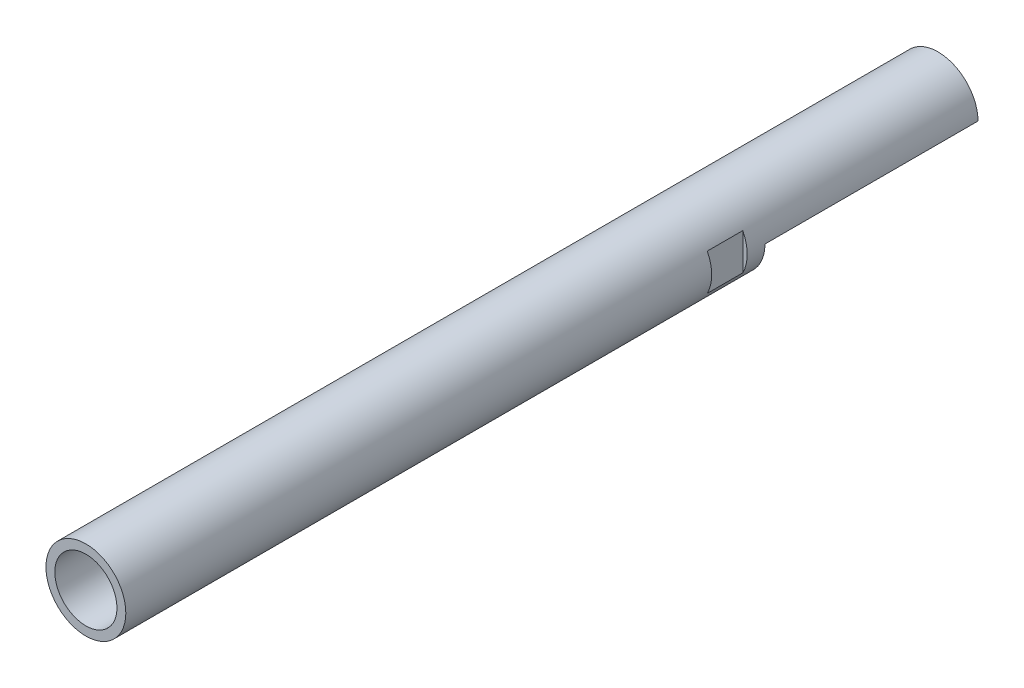
ISO-10303-21;
HEADER;
FILE_DESCRIPTION(('STEP AP214'),'2;1');
FILE_NAME('part.step','',(''),(''),'','','');
FILE_SCHEMA(('AUTOMOTIVE_DESIGN { 1 0 10303 214 1 1 1 1 }'));
ENDSEC;
DATA;
#1=APPLICATION_CONTEXT('core data for automotive mechanical design processes');
#2=APPLICATION_PROTOCOL_DEFINITION('international standard','automotive_design',2000,#1);
#3=PRODUCT_CONTEXT('',#1,'mechanical');
#4=PRODUCT('Part','Part','',(#3));
#5=PRODUCT_RELATED_PRODUCT_CATEGORY('part','',(#4));
#6=PRODUCT_DEFINITION_FORMATION('','',#4);
#7=PRODUCT_DEFINITION_CONTEXT('part definition',#1,'design');
#8=PRODUCT_DEFINITION('design','',#6,#7);
#9=PRODUCT_DEFINITION_SHAPE('','',#8);
#10=(LENGTH_UNIT() NAMED_UNIT(*) SI_UNIT(.MILLI.,.METRE.));
#11=(NAMED_UNIT(*) PLANE_ANGLE_UNIT() SI_UNIT($,.RADIAN.));
#12=(NAMED_UNIT(*) SI_UNIT($,.STERADIAN.) SOLID_ANGLE_UNIT());
#13=UNCERTAINTY_MEASURE_WITH_UNIT(LENGTH_MEASURE(1.E-05),#10,'distance_accuracy_value','');
#14=(GEOMETRIC_REPRESENTATION_CONTEXT(3) GLOBAL_UNCERTAINTY_ASSIGNED_CONTEXT((#13)) GLOBAL_UNIT_ASSIGNED_CONTEXT((#10,
#11,#12)) REPRESENTATION_CONTEXT('',''));
#15=CARTESIAN_POINT('',(0.,0.,0.));
#16=DIRECTION('',(0.,0.,1.));
#17=DIRECTION('',(1.,0.,0.));
#18=AXIS2_PLACEMENT_3D('',#15,#16,#17);
#19=CARTESIAN_POINT('',(0.,0.,304.8));
#20=DIRECTION('',(0.,0.,-1.));
#21=DIRECTION('',(-1.,0.,0.));
#22=AXIS2_PLACEMENT_3D('',#19,#20,#21);
#23=CYLINDRICAL_SURFACE('',#22,14.2875);
#24=CARTESIAN_POINT('',(0.,0.,95.25));
#25=DIRECTION('',(0.,0.,-1.));
#26=DIRECTION('',(-1.,0.,0.));
#27=AXIS2_PLACEMENT_3D('',#24,#25,#26);
#28=CIRCLE('',#27,14.2875);
#29=CARTESIAN_POINT('',(12.7,6.54543018066803,95.25));
#30=VERTEX_POINT('',#29);
#31=CARTESIAN_POINT('',(12.7,-6.54543018066804,95.25));
#32=VERTEX_POINT('',#31);
#33=EDGE_CURVE('E125',#30,#32,#28,.T.);
#34=ORIENTED_EDGE('',*,*,#33,.F.);
#35=DIRECTION('',(0.,0.,-1.));
#36=VECTOR('',#35,1.);
#37=CARTESIAN_POINT('',(12.7,6.54543018066803,95.25));
#38=LINE('',#37,#36);
#39=CARTESIAN_POINT('',(12.7,6.54543018066803,82.55));
#40=VERTEX_POINT('',#39);
#41=EDGE_CURVE('E129',#30,#40,#38,.T.);
#42=ORIENTED_EDGE('',*,*,#41,.T.);
#43=CARTESIAN_POINT('',(0.,0.,82.55));
#44=DIRECTION('',(0.,0.,-1.));
#45=DIRECTION('',(-1.,0.,0.));
#46=AXIS2_PLACEMENT_3D('',#43,#44,#45);
#47=CIRCLE('',#46,14.2875);
#48=CARTESIAN_POINT('',(12.7,-6.54543018066803,82.55));
#49=VERTEX_POINT('',#48);
#50=EDGE_CURVE('E126',#40,#49,#47,.T.);
#51=ORIENTED_EDGE('',*,*,#50,.T.);
#52=DIRECTION('',(0.,0.,-1.));
#53=VECTOR('',#52,1.);
#54=CARTESIAN_POINT('',(12.7,-6.54543018066804,95.25));
#55=LINE('',#54,#53);
#56=EDGE_CURVE('E119',#32,#49,#55,.T.);
#57=ORIENTED_EDGE('',*,*,#56,.F.);
#58=EDGE_LOOP('',(#34,#42,#51,#57));
#59=FACE_BOUND('',#58,.T.);
#60=CARTESIAN_POINT('',(0.,0.,304.8));
#61=DIRECTION('',(0.,0.,1.));
#62=DIRECTION('',(1.,0.,0.));
#63=AXIS2_PLACEMENT_3D('',#60,#61,#62);
#64=CIRCLE('',#63,14.2875);
#65=CARTESIAN_POINT('',(14.2875,0.,304.8));
#66=VERTEX_POINT('',#65);
#67=EDGE_CURVE('E11',#66,#66,#64,.T.);
#68=ORIENTED_EDGE('',*,*,#67,.F.);
#69=EDGE_LOOP('',(#68));
#70=FACE_BOUND('',#69,.T.);
#71=CARTESIAN_POINT('',(0.,0.,76.2));
#72=DIRECTION('',(0.,0.,-1.));
#73=DIRECTION('',(-1.,0.,0.));
#74=AXIS2_PLACEMENT_3D('',#71,#72,#73);
#75=CIRCLE('',#74,14.2875);
#76=CARTESIAN_POINT('',(14.2875,0.,76.2));
#77=VERTEX_POINT('',#76);
#78=CARTESIAN_POINT('',(-14.2875,0.,76.2));
#79=VERTEX_POINT('',#78);
#80=EDGE_CURVE('E137',#77,#79,#75,.T.);
#81=ORIENTED_EDGE('',*,*,#80,.F.);
#82=DIRECTION('',(0.,0.,-1.));
#83=VECTOR('',#82,1.);
#84=CARTESIAN_POINT('',(14.2875,0.,76.2));
#85=LINE('',#84,#83);
#86=CARTESIAN_POINT('',(14.2875,0.,0.));
#87=VERTEX_POINT('',#86);
#88=EDGE_CURVE('E146',#77,#87,#85,.T.);
#89=ORIENTED_EDGE('',*,*,#88,.T.);
#90=CARTESIAN_POINT('',(0.,0.,0.));
#91=DIRECTION('',(0.,0.,1.));
#92=DIRECTION('',(1.,0.,0.));
#93=AXIS2_PLACEMENT_3D('',#90,#91,#92);
#94=CIRCLE('',#93,14.2875);
#95=CARTESIAN_POINT('',(-14.2875,0.,0.));
#96=VERTEX_POINT('',#95);
#97=EDGE_CURVE('E41',#87,#96,#94,.T.);
#98=ORIENTED_EDGE('',*,*,#97,.T.);
#99=DIRECTION('',(0.,0.,-1.));
#100=VECTOR('',#99,1.);
#101=CARTESIAN_POINT('',(-14.2875,0.,76.2));
#102=LINE('',#101,#100);
#103=EDGE_CURVE('E144',#79,#96,#102,.T.);
#104=ORIENTED_EDGE('',*,*,#103,.F.);
#105=EDGE_LOOP('',(#81,#89,#98,#104));
#106=FACE_BOUND('',#105,.T.);
#107=CARTESIAN_POINT('',(0.,0.,95.25));
#108=DIRECTION('',(0.,0.,-1.));
#109=DIRECTION('',(-1.,0.,0.));
#110=AXIS2_PLACEMENT_3D('',#107,#108,#109);
#111=CIRCLE('',#110,14.2875);
#112=CARTESIAN_POINT('',(6.54543018066803,-12.7,95.25));
#113=VERTEX_POINT('',#112);
#114=CARTESIAN_POINT('',(-6.54543018066803,-12.7,95.25));
#115=VERTEX_POINT('',#114);
#116=EDGE_CURVE('E107',#113,#115,#111,.T.);
#117=ORIENTED_EDGE('',*,*,#116,.F.);
#118=DIRECTION('',(0.,0.,-1.));
#119=VECTOR('',#118,1.);
#120=CARTESIAN_POINT('',(6.54543018066803,-12.7,95.25));
#121=LINE('',#120,#119);
#122=CARTESIAN_POINT('',(6.54543018066803,-12.7,82.55));
#123=VERTEX_POINT('',#122);
#124=EDGE_CURVE('E98',#113,#123,#121,.T.);
#125=ORIENTED_EDGE('',*,*,#124,.T.);
#126=CARTESIAN_POINT('',(0.,0.,82.55));
#127=DIRECTION('',(0.,0.,-1.));
#128=DIRECTION('',(-1.,0.,0.));
#129=AXIS2_PLACEMENT_3D('',#126,#127,#128);
#130=CIRCLE('',#129,14.2875);
#131=CARTESIAN_POINT('',(-6.54543018066803,-12.7,82.55));
#132=VERTEX_POINT('',#131);
#133=EDGE_CURVE('E112',#123,#132,#130,.T.);
#134=ORIENTED_EDGE('',*,*,#133,.T.);
#135=DIRECTION('',(0.,0.,-1.));
#136=VECTOR('',#135,1.);
#137=CARTESIAN_POINT('',(-6.54543018066803,-12.7,95.25));
#138=LINE('',#137,#136);
#139=EDGE_CURVE('E106',#115,#132,#138,.T.);
#140=ORIENTED_EDGE('',*,*,#139,.F.);
#141=EDGE_LOOP('',(#117,#125,#134,#140));
#142=FACE_BOUND('',#141,.T.);
#143=CARTESIAN_POINT('',(-3.175,-13.930255964985,158.75));
#144=CARTESIAN_POINT('',(-3.17499404604868,-13.930259519501,158.925962258749));
#145=CARTESIAN_POINT('',(-3.16032218368744,-13.9336263325875,159.101995442595));
#146=CARTESIAN_POINT('',(-3.10208967570228,-13.9467040574412,159.449050586416));
#147=CARTESIAN_POINT('',(-3.05850857851013,-13.9564194603865,159.620068909173));
#148=CARTESIAN_POINT('',(-2.94390188320744,-13.9810409414811,159.952023920353));
#149=CARTESIAN_POINT('',(-2.87290695420968,-13.9959412172404,160.112971642226));
#150=CARTESIAN_POINT('',(-2.70557630453556,-14.029246552643,160.420677073703));
#151=CARTESIAN_POINT('',(-2.60924093365102,-14.047651563907,160.567434979142));
#152=CARTESIAN_POINT('',(-2.39217370591358,-14.0862510896236,160.845154832047));
#153=CARTESIAN_POINT('',(-2.27108337024512,-14.1064691172362,160.975833372365));
#154=CARTESIAN_POINT('',(-2.00871721519604,-14.1462109672236,161.215201369497));
#155=CARTESIAN_POINT('',(-1.86743979669659,-14.1657347344495,161.323889082659));
#156=CARTESIAN_POINT('',(-1.56680526306463,-14.2021447732274,161.51731531784));
#157=CARTESIAN_POINT('',(-1.40726829374626,-14.219000064093,161.601780633507));
#158=CARTESIAN_POINT('',(-1.07582705784746,-14.2479081363258,161.742595935231));
#159=CARTESIAN_POINT('',(-0.903924227211034,-14.2599614742443,161.798949179698));
#160=CARTESIAN_POINT('',(-0.555578639171225,-14.2777413909176,161.88104757479));
#161=CARTESIAN_POINT('',(-0.379254112365794,-14.2835670469651,161.907272560856));
#162=CARTESIAN_POINT('',(-0.0246184067353064,-14.2885786896136,161.92987088001));
#163=CARTESIAN_POINT('',(0.153692535319019,-14.2877654592567,161.92624773362));
#164=CARTESIAN_POINT('',(0.503929524483278,-14.2796664709516,161.889608715538));
#165=CARTESIAN_POINT('',(0.675912707619359,-14.2724946262242,161.857110119443));
#166=CARTESIAN_POINT('',(1.01192146730018,-14.2526143271741,161.764467765256));
#167=CARTESIAN_POINT('',(1.17594667614171,-14.2399056172874,161.704322731085));
#168=CARTESIAN_POINT('',(1.4928116089081,-14.2101973003647,161.557641428615));
#169=CARTESIAN_POINT('',(1.64555808316926,-14.1931661867752,161.470910362486));
#170=CARTESIAN_POINT('',(1.93451660426488,-14.1566784379842,161.273664475856));
#171=CARTESIAN_POINT('',(2.07072632689939,-14.1372214626108,161.163146318176));
#172=CARTESIAN_POINT('',(2.32582242095955,-14.0975265059119,160.918651692258));
#173=CARTESIAN_POINT('',(2.44427409683096,-14.0772807252366,160.784222538146));
#174=CARTESIAN_POINT('',(2.65703531045116,-14.0386803528947,160.497198138158));
#175=CARTESIAN_POINT('',(2.75134415041243,-14.0203258158989,160.344602367408));
#176=CARTESIAN_POINT('',(2.91334453391603,-13.9875646328247,160.024857927247));
#177=CARTESIAN_POINT('',(2.98095157937149,-13.9731705625883,159.857665071298));
#178=CARTESIAN_POINT('',(3.08697740368037,-13.9501326612632,159.513895203089));
#179=CARTESIAN_POINT('',(3.1254009782066,-13.9414878854313,159.337319737763));
#180=CARTESIAN_POINT('',(3.17128999504126,-13.9311206720646,158.983775270537));
#181=CARTESIAN_POINT('',(3.1793894179382,-13.9292564979198,158.806892616963));
#182=CARTESIAN_POINT('',(3.16611869036104,-13.9322788482822,158.45430443479));
#183=CARTESIAN_POINT('',(3.1447506349786,-13.9371648928594,158.278598823396));
#184=CARTESIAN_POINT('',(3.07370221749834,-13.9530030866465,157.93557513423));
#185=CARTESIAN_POINT('',(3.02437312088928,-13.9638799283206,157.768180501719));
#186=CARTESIAN_POINT('',(2.89918418032709,-13.9904058599556,157.444032598082));
#187=CARTESIAN_POINT('',(2.82332172999641,-14.0060554187221,157.287280374169));
#188=CARTESIAN_POINT('',(2.64583021389399,-14.0406735005904,156.98612938218));
#189=CARTESIAN_POINT('',(2.54381181722467,-14.0596906963536,156.841965787461));
#190=CARTESIAN_POINT('',(2.31741193066364,-14.0987739044538,156.572571732614));
#191=CARTESIAN_POINT('',(2.19302756963037,-14.1188400512109,156.447343707067));
#192=CARTESIAN_POINT('',(1.92255332820072,-14.1582288260966,156.21690349218));
#193=CARTESIAN_POINT('',(1.77609088811511,-14.1775296321132,156.112124218057));
#194=CARTESIAN_POINT('',(1.46727570740137,-14.2128067191643,155.928656686903));
#195=CARTESIAN_POINT('',(1.30492372176574,-14.2287831580436,155.849967190994));
#196=CARTESIAN_POINT('',(0.969965516255234,-14.2555196334235,155.721510193019));
#197=CARTESIAN_POINT('',(0.797433616226876,-14.2663132284701,155.671556201518));
#198=CARTESIAN_POINT('',(0.446159075288006,-14.2816131801047,155.601407808474));
#199=CARTESIAN_POINT('',(0.267417372081238,-14.2861204817538,155.581208933617));
#200=CARTESIAN_POINT('',(-0.0870979422953396,-14.2883108188044,155.571350682989));
#201=CARTESIAN_POINT('',(-0.262853020356213,-14.286138103284,155.581045786328));
#202=CARTESIAN_POINT('',(-0.610162040668765,-14.275522732602,155.629252734009));
#203=CARTESIAN_POINT('',(-0.781716063157473,-14.267080197286,155.667764027538));
#204=CARTESIAN_POINT('',(-1.11523507709879,-14.2448857383981,155.772196642047));
#205=CARTESIAN_POINT('',(-1.27723087619186,-14.2311520842578,155.838023705442));
#206=CARTESIAN_POINT('',(-1.58796280084769,-14.1998396361702,155.995128388119));
#207=CARTESIAN_POINT('',(-1.73669759306773,-14.1822604561825,156.086408562811));
#208=CARTESIAN_POINT('',(-2.0198253029721,-14.1447437865216,156.293918865473));
#209=CARTESIAN_POINT('',(-2.15388151644881,-14.1247669543449,156.410601319157));
#210=CARTESIAN_POINT('',(-2.40073137511054,-14.0849144764458,156.664695141618));
#211=CARTESIAN_POINT('',(-2.51351986498645,-14.0650388563904,156.802111521817));
#212=CARTESIAN_POINT('',(-2.716146636879,-14.0273305013928,157.096070268413));
#213=CARTESIAN_POINT('',(-2.80564408799536,-14.0095300058213,157.252851954076));
#214=CARTESIAN_POINT('',(-2.9568779179041,-13.9783953379606,157.579594821402));
#215=CARTESIAN_POINT('',(-3.01863745352613,-13.9650574424787,157.749544870018));
#216=CARTESIAN_POINT('',(-3.10180592276854,-13.9467847451289,158.058019027563));
#217=CARTESIAN_POINT('',(-3.12920034001176,-13.940628146666,158.194888440797));
#218=CARTESIAN_POINT('',(-3.16579926545841,-13.9323624532779,158.471157143571));
#219=CARTESIAN_POINT('',(-3.17500471829016,-13.9302531481602,158.610556301352));
#220=CARTESIAN_POINT('',(-3.175,-13.930255964985,158.75));
#221=B_SPLINE_CURVE_WITH_KNOTS('',3,(#143,#144,#145,#146,#147,#148,#149,#150,#151,#152,#153,
#154,#155,#156,#157,#158,#159,#160,#161,#162,#163,#164,#165,#166,#167,#168,#169,#170,#171,#172,
#173,#174,#175,#176,#177,#178,#179,#180,#181,#182,#183,#184,#185,#186,#187,#188,#189,#190,#191,
#192,#193,#194,#195,#196,#197,#198,#199,#200,#201,#202,#203,#204,#205,#206,#207,#208,#209,#210,
#211,#212,#213,#214,#215,#216,#217,#218,#219,#220),.UNSPECIFIED.,.T.,.F.,(4,2,2,2,2,2,2,2,2,2,2,
2,2,2,2,2,2,2,2,2,2,2,2,2,2,2,2,2,2,2,2,2,2,2,2,2,2,2,4),(0.,0.527375623270274,1.05512473195785,
1.58228512612352,2.10943824390794,2.64484792847433,3.18030004903129,3.72157327570458,
4.26278374999437,4.79524967222896,5.32765279219154,5.85070651422449,6.37378438131147,
6.90079039585311,7.42787039426262,7.9662662508554,8.50467766666054,9.0447794950239,
9.58479255010871,10.1134505235966,10.6420709122667,11.1641930950071,11.6863665803431,
12.2168162560825,12.7473340748624,13.2880901059809,13.8288204555144,14.366000755148,
14.9031002881155,15.4286837026383,15.9542570710682,16.4780317470367,17.0018590272636,
17.5359134526346,18.0700971671722,18.6117066731652,19.1528631754363,19.5708109075415,
19.988736933318),.UNSPECIFIED.);
#222=CARTESIAN_POINT('',(-3.175,-13.930255964985,158.75));
#223=VERTEX_POINT('',#222);
#224=EDGE_CURVE('E131',#223,#223,#221,.T.);
#225=ORIENTED_EDGE('',*,*,#224,.T.);
#226=EDGE_LOOP('',(#225));
#227=FACE_BOUND('',#226,.T.);
#228=ADVANCED_FACE('F33',(#59,#70,#106,#142,#227),#23,.T.);
#229=CARTESIAN_POINT('',(0.,0.,304.8));
#230=DIRECTION('',(0.,0.,-1.));
#231=DIRECTION('',(-1.,0.,0.));
#232=AXIS2_PLACEMENT_3D('',#229,#230,#231);
#233=CYLINDRICAL_SURFACE('',#232,9.525);
#234=CARTESIAN_POINT('',(0.,0.,285.75));
#235=DIRECTION('',(0.,0.,1.));
#236=DIRECTION('',(1.,0.,0.));
#237=AXIS2_PLACEMENT_3D('',#234,#235,#236);
#238=CIRCLE('',#237,9.525);
#239=CARTESIAN_POINT('',(9.525,0.,285.75));
#240=VERTEX_POINT('',#239);
#241=EDGE_CURVE('E36',#240,#240,#238,.T.);
#242=ORIENTED_EDGE('',*,*,#241,.T.);
#243=EDGE_LOOP('',(#242));
#244=FACE_BOUND('',#243,.T.);
#245=DIRECTION('',(0.,0.,-1.));
#246=VECTOR('',#245,1.);
#247=CARTESIAN_POINT('',(9.525,0.,304.8));
#248=LINE('',#247,#246);
#249=CARTESIAN_POINT('',(9.525,0.,76.2));
#250=VERTEX_POINT('',#249);
#251=CARTESIAN_POINT('',(9.52499999999999,0.,0.));
#252=VERTEX_POINT('',#251);
#253=EDGE_CURVE('E155',#250,#252,#248,.T.);
#254=ORIENTED_EDGE('',*,*,#253,.F.);
#255=CARTESIAN_POINT('',(0.,0.,76.2));
#256=DIRECTION('',(0.,0.,-1.));
#257=DIRECTION('',(-1.,0.,0.));
#258=AXIS2_PLACEMENT_3D('',#255,#256,#257);
#259=CIRCLE('',#258,9.525);
#260=CARTESIAN_POINT('',(-9.525,0.,76.2));
#261=VERTEX_POINT('',#260);
#262=EDGE_CURVE('E149',#250,#261,#259,.T.);
#263=ORIENTED_EDGE('',*,*,#262,.T.);
#264=DIRECTION('',(0.,0.,-1.));
#265=VECTOR('',#264,1.);
#266=CARTESIAN_POINT('',(-9.525,0.,304.8));
#267=LINE('',#266,#265);
#268=CARTESIAN_POINT('',(-9.525,0.,0.));
#269=VERTEX_POINT('',#268);
#270=EDGE_CURVE('E153',#269,#261,#267,.F.);
#271=ORIENTED_EDGE('',*,*,#270,.F.);
#272=CARTESIAN_POINT('',(0.,0.,0.));
#273=DIRECTION('',(0.,0.,1.));
#274=DIRECTION('',(1.,0.,0.));
#275=AXIS2_PLACEMENT_3D('',#272,#273,#274);
#276=CIRCLE('',#275,9.525);
#277=EDGE_CURVE('E163',#252,#269,#276,.T.);
#278=ORIENTED_EDGE('',*,*,#277,.F.);
#279=EDGE_LOOP('',(#254,#263,#271,#278));
#280=FACE_BOUND('',#279,.T.);
#281=CARTESIAN_POINT('',(3.175,-8.98025612106916,158.75));
#282=CARTESIAN_POINT('',(3.17500081898399,-8.98025555134128,158.922936455105));
#283=CARTESIAN_POINT('',(3.16082293820153,-8.98530617498472,159.09586798944));
#284=CARTESIAN_POINT('',(3.10467734311197,-9.00485797707984,159.436607786657));
#285=CARTESIAN_POINT('',(3.06270505113466,-9.01936071226449,159.604415200845));
#286=CARTESIAN_POINT('',(2.95260866704957,-9.05599546711914,159.929915385266));
#287=CARTESIAN_POINT('',(2.8845358279553,-9.07811252608947,160.087627275981));
#288=CARTESIAN_POINT('',(2.72434567030138,-9.12746212382781,160.38944315414));
#289=CARTESIAN_POINT('',(2.63222304663108,-9.15469579088969,160.533544129608));
#290=CARTESIAN_POINT('',(2.42268738995613,-9.21240503868728,160.809685880424));
#291=CARTESIAN_POINT('',(2.30449228387488,-9.24296141131745,160.941116486033));
#292=CARTESIAN_POINT('',(2.04783584340569,-9.30319020743185,161.182706593888));
#293=CARTESIAN_POINT('',(1.90937126079128,-9.33286248831954,161.292862680274));
#294=CARTESIAN_POINT('',(1.61164431278889,-9.38891527476712,161.491545499021));
#295=CARTESIAN_POINT('',(1.45193356813785,-9.41518969452598,161.579432906712));
#296=CARTESIAN_POINT('',(1.11896913298521,-9.46053437997871,161.72685328278));
#297=CARTESIAN_POINT('',(0.945719107056874,-9.47960658694532,161.786393892837));
#298=CARTESIAN_POINT('',(0.596991495351316,-9.50782564496304,161.873361338458));
#299=CARTESIAN_POINT('',(0.421801146658147,-9.5172947441875,161.901833441866));
#300=CARTESIAN_POINT('',(0.0688907525664582,-9.52638456092937,161.92917923142));
#301=CARTESIAN_POINT('',(-0.108828629001896,-9.52600781684693,161.928060546496));
#302=CARTESIAN_POINT('',(-0.454353660740385,-9.51566675789472,161.896919491753));
#303=CARTESIAN_POINT('',(-0.622274754278533,-9.50607905597498,161.868032472093));
#304=CARTESIAN_POINT('',(-0.950732918260417,-9.47886621303647,161.784052285387));
#305=CARTESIAN_POINT('',(-1.11126948744903,-9.46124052729002,161.728957342239));
#306=CARTESIAN_POINT('',(-1.42288410762328,-9.41945253180987,161.593462317553));
#307=CARTESIAN_POINT('',(-1.5738101015761,-9.39520735013749,161.512739145115));
#308=CARTESIAN_POINT('',(-1.86030973354926,-9.34270397898568,161.328545435201));
#309=CARTESIAN_POINT('',(-1.99587908667347,-9.31444467439657,161.225068572435));
#310=CARTESIAN_POINT('',(-2.25457025130042,-9.25532159123421,160.992583800765));
#311=CARTESIAN_POINT('',(-2.37680549868225,-9.22439783161187,160.862603223853));
#312=CARTESIAN_POINT('',(-2.59803029922421,-9.1645528941526,160.583725295818));
#313=CARTESIAN_POINT('',(-2.69701626991892,-9.13563202542328,160.434825034813));
#314=CARTESIAN_POINT('',(-2.8701601697385,-9.08273917259531,160.119524738709));
#315=CARTESIAN_POINT('',(-2.94394402199777,-9.05884361979074,159.952905483066));
#316=CARTESIAN_POINT('',(-3.06210713863015,-9.01959241367422,159.608610823369));
#317=CARTESIAN_POINT('',(-3.10649872649829,-9.00423318171519,159.43094008717));
#318=CARTESIAN_POINT('',(-3.16281207065963,-8.98460345301983,159.078173221568));
#319=CARTESIAN_POINT('',(-3.17610837823673,-8.9798639401205,158.903322576423));
#320=CARTESIAN_POINT('',(-3.17374726853836,-8.9806993378791,158.553860726563));
#321=CARTESIAN_POINT('',(-3.15809511009497,-8.98627237514011,158.379249484124));
#322=CARTESIAN_POINT('',(-3.09951644367858,-9.00663737436701,158.041476633865));
#323=CARTESIAN_POINT('',(-3.05754530088867,-9.02110608274668,157.878127759271));
#324=CARTESIAN_POINT('',(-2.94866651362948,-9.05727657905498,157.560824050191));
#325=CARTESIAN_POINT('',(-2.88175444845385,-9.07897964918116,157.406870886699));
#326=CARTESIAN_POINT('',(-2.7224810318461,-9.12802586366624,157.107317163811));
#327=CARTESIAN_POINT('',(-2.6293798007882,-9.15552606488371,156.962136409612));
#328=CARTESIAN_POINT('',(-2.42120937702022,-9.21276315720815,156.688961283682));
#329=CARTESIAN_POINT('',(-2.30613370845861,-9.24250070609048,156.560971997251));
#330=CARTESIAN_POINT('',(-2.05070616623351,-9.30259247675171,156.319448650512));
#331=CARTESIAN_POINT('',(-1.9094045839856,-9.33290753359822,156.20690631169));
#332=CARTESIAN_POINT('',(-1.6091766501958,-9.38932753871621,156.007066248045));
#333=CARTESIAN_POINT('',(-1.45025092494494,-9.41543263651181,155.919767626559));
#334=CARTESIAN_POINT('',(-1.12007606322252,-9.46036988448665,155.773691167064));
#335=CARTESIAN_POINT('',(-0.948915816544786,-9.47924920264386,155.714727695055));
#336=CARTESIAN_POINT('',(-0.598355629061087,-9.50781089409934,155.626664418959));
#337=CARTESIAN_POINT('',(-0.418958686953581,-9.5174965870801,155.597553835129));
#338=CARTESIAN_POINT('',(-0.0660886913556104,-9.52632915775114,155.570992903602));
#339=CARTESIAN_POINT('',(0.107266498446077,-9.52594996283969,155.572118833765));
#340=CARTESIAN_POINT('',(0.451202885375569,-9.51586223949089,155.602486953365));
#341=CARTESIAN_POINT('',(0.621784306400523,-9.50615446789103,155.631726861885));
#342=CARTESIAN_POINT('',(0.952633729196803,-9.47867404980259,155.716548594779));
#343=CARTESIAN_POINT('',(1.11302251014812,-9.46103195296647,155.771704633746));
#344=CARTESIAN_POINT('',(1.42233126423386,-9.41949985236771,155.906398661233));
#345=CARTESIAN_POINT('',(1.57124915665223,-9.39560871852452,155.985941060251));
#346=CARTESIAN_POINT('',(1.8593880017804,-9.34294133528522,156.170533200924));
#347=CARTESIAN_POINT('',(1.99804734869541,-9.31401720161867,156.276416826087));
#348=CARTESIAN_POINT('',(2.25609475841496,-9.25490239414217,156.509267216921));
#349=CARTESIAN_POINT('',(2.37547664865808,-9.22471131854583,156.636240709184));
#350=CARTESIAN_POINT('',(2.59633024304515,-9.16505913446274,156.913609703989));
#351=CARTESIAN_POINT('',(2.69691791704333,-9.13567286363902,157.064727497351));
#352=CARTESIAN_POINT('',(2.87119803998104,-9.08241113800574,157.382636805416));
#353=CARTESIAN_POINT('',(2.94489751640183,-9.05853424386966,157.549424210369));
#354=CARTESIAN_POINT('',(3.06020415454822,-9.02021736105684,157.88627879125));
#355=CARTESIAN_POINT('',(3.10311136154972,-9.00539959321554,158.055856936693));
#356=CARTESIAN_POINT('',(3.16050396647392,-8.98542092737971,158.400292960232));
#357=CARTESIAN_POINT('',(3.17499917194918,-8.9802566971044,158.575148995279));
#358=CARTESIAN_POINT('',(3.175,-8.98025612106916,158.75));
#359=B_SPLINE_CURVE_WITH_KNOTS('',3,(#281,#282,#283,#284,#285,#286,#287,#288,#289,#290,#291,
#292,#293,#294,#295,#296,#297,#298,#299,#300,#301,#302,#303,#304,#305,#306,#307,#308,#309,#310,
#311,#312,#313,#314,#315,#316,#317,#318,#319,#320,#321,#322,#323,#324,#325,#326,#327,#328,#329,
#330,#331,#332,#333,#334,#335,#336,#337,#338,#339,#340,#341,#342,#343,#344,#345,#346,#347,#348,
#349,#350,#351,#352,#353,#354,#355,#356,#357,#358),.UNSPECIFIED.,.T.,.F.,(4,2,2,2,2,2,2,2,2,2,2,
2,2,2,2,2,2,2,2,2,2,2,2,2,2,2,2,2,2,2,2,2,2,2,2,2,2,2,4),(0.,0.518161856737926,1.03640907467316,
1.55364379231514,2.07099270263877,2.6067174633253,3.14252816921063,3.69231882006113,
4.24196117528058,4.77247962078669,5.30286129234891,5.81244090321183,6.32205505300828,
6.83836754181565,7.35482374200021,7.89559553605441,8.43645060268438,8.98501631501702,
9.53335188057253,10.0569487508209,10.5804505128322,11.0859695656586,11.5915782629155,
12.113223733109,12.6350231697726,13.1819271594322,13.7288117205517,14.2720628703095,
14.815117785382,15.3326491885149,15.8501386073106,16.3594083542837,16.868770261733,
17.3969527447801,17.9253040157361,18.4743376618726,19.023227709973,19.5473069861654,
20.0712053232972),.UNSPECIFIED.);
#360=CARTESIAN_POINT('',(3.175,-8.98025612106916,158.75));
#361=VERTEX_POINT('',#360);
#362=EDGE_CURVE('E344',#361,#361,#359,.T.);
#363=ORIENTED_EDGE('',*,*,#362,.T.);
#364=EDGE_LOOP('',(#363));
#365=FACE_BOUND('',#364,.T.);
#366=ADVANCED_FACE('F181',(#244,#280,#365),#233,.F.);
#367=CARTESIAN_POINT('',(0.,0.,304.8));
#368=DIRECTION('',(0.,0.,1.));
#369=DIRECTION('',(1.,0.,0.));
#370=AXIS2_PLACEMENT_3D('',#367,#368,#369);
#371=PLANE('',#370);
#372=CARTESIAN_POINT('',(0.,0.,304.8));
#373=DIRECTION('',(0.,0.,1.));
#374=DIRECTION('',(1.,0.,0.));
#375=AXIS2_PLACEMENT_3D('',#372,#373,#374);
#376=CIRCLE('',#375,11.1125);
#377=CARTESIAN_POINT('',(11.1125,0.,304.8));
#378=VERTEX_POINT('',#377);
#379=EDGE_CURVE('E157',#378,#378,#376,.T.);
#380=ORIENTED_EDGE('',*,*,#379,.F.);
#381=EDGE_LOOP('',(#380));
#382=FACE_BOUND('',#381,.T.);
#383=ORIENTED_EDGE('',*,*,#67,.T.);
#384=EDGE_LOOP('',(#383));
#385=FACE_BOUND('',#384,.T.);
#386=ADVANCED_FACE('F205',(#382,#385),#371,.T.);
#387=CARTESIAN_POINT('',(0.,0.,0.));
#388=DIRECTION('',(0.,0.,1.));
#389=DIRECTION('',(1.,0.,0.));
#390=AXIS2_PLACEMENT_3D('',#387,#388,#389);
#391=PLANE('',#390);
#392=ORIENTED_EDGE('',*,*,#97,.F.);
#393=DIRECTION('',(1.,0.,0.));
#394=VECTOR('',#393,1.);
#395=CARTESIAN_POINT('',(-14.2875,0.,0.));
#396=LINE('',#395,#394);
#397=EDGE_CURVE('E121',#252,#87,#396,.T.);
#398=ORIENTED_EDGE('',*,*,#397,.F.);
#399=ORIENTED_EDGE('',*,*,#277,.T.);
#400=EDGE_CURVE('E140',#96,#269,#396,.T.);
#401=ORIENTED_EDGE('',*,*,#400,.F.);
#402=EDGE_LOOP('',(#392,#398,#399,#401));
#403=FACE_BOUND('',#402,.T.);
#404=ADVANCED_FACE('F173',(#403),#391,.F.);
#405=CARTESIAN_POINT('',(0.,0.,285.75));
#406=DIRECTION('',(0.,0.,1.));
#407=DIRECTION('',(1.,0.,0.));
#408=AXIS2_PLACEMENT_3D('',#405,#406,#407);
#409=CYLINDRICAL_SURFACE('',#408,11.1125);
#410=CARTESIAN_POINT('',(0.,0.,285.75));
#411=DIRECTION('',(0.,0.,1.));
#412=DIRECTION('',(1.,0.,0.));
#413=AXIS2_PLACEMENT_3D('',#410,#411,#412);
#414=CIRCLE('',#413,11.1125);
#415=CARTESIAN_POINT('',(11.1125,0.,285.75));
#416=VERTEX_POINT('',#415);
#417=EDGE_CURVE('E158',#416,#416,#414,.T.);
#418=CARTESIAN_POINT('',(11.1125,0.,285.75));
#419=CARTESIAN_POINT('',(11.1125,0.,285.9484375));
#420=CARTESIAN_POINT('',(11.1125,0.,286.146875));
#421=CARTESIAN_POINT('',(11.1125,0.,286.54375));
#422=CARTESIAN_POINT('',(11.1125,0.,286.7421875));
#423=CARTESIAN_POINT('',(11.1125,0.,287.1390625));
#424=CARTESIAN_POINT('',(11.1125,0.,287.3375));
#425=CARTESIAN_POINT('',(11.1125,0.,287.734375));
#426=CARTESIAN_POINT('',(11.1125,0.,287.9328125));
#427=CARTESIAN_POINT('',(11.1125,0.,288.3296875));
#428=CARTESIAN_POINT('',(11.1125,0.,288.528125));
#429=CARTESIAN_POINT('',(11.1125,0.,288.925));
#430=CARTESIAN_POINT('',(11.1125,0.,289.1234375));
#431=CARTESIAN_POINT('',(11.1125,0.,289.5203125));
#432=CARTESIAN_POINT('',(11.1125,0.,289.71875));
#433=CARTESIAN_POINT('',(11.1125,0.,290.115625));
#434=CARTESIAN_POINT('',(11.1125,0.,290.3140625));
#435=CARTESIAN_POINT('',(11.1125,0.,290.7109375));
#436=CARTESIAN_POINT('',(11.1125,0.,290.909375));
#437=CARTESIAN_POINT('',(11.1125,0.,291.30625));
#438=CARTESIAN_POINT('',(11.1125,0.,291.5046875));
#439=CARTESIAN_POINT('',(11.1125,0.,291.9015625));
#440=CARTESIAN_POINT('',(11.1125,0.,292.1));
#441=CARTESIAN_POINT('',(11.1125,0.,292.496875));
#442=CARTESIAN_POINT('',(11.1125,0.,292.6953125));
#443=CARTESIAN_POINT('',(11.1125,0.,293.0921875));
#444=CARTESIAN_POINT('',(11.1125,0.,293.290625));
#445=CARTESIAN_POINT('',(11.1125,0.,293.6875));
#446=CARTESIAN_POINT('',(11.1125,0.,293.8859375));
#447=CARTESIAN_POINT('',(11.1125,0.,294.2828125));
#448=CARTESIAN_POINT('',(11.1125,0.,294.48125));
#449=CARTESIAN_POINT('',(11.1125,0.,294.878125));
#450=CARTESIAN_POINT('',(11.1125,0.,295.0765625));
#451=CARTESIAN_POINT('',(11.1125,0.,295.4734375));
#452=CARTESIAN_POINT('',(11.1125,0.,295.671875));
#453=CARTESIAN_POINT('',(11.1125,0.,296.06875));
#454=CARTESIAN_POINT('',(11.1125,0.,296.2671875));
#455=CARTESIAN_POINT('',(11.1125,0.,296.6640625));
#456=CARTESIAN_POINT('',(11.1125,0.,296.8625));
#457=CARTESIAN_POINT('',(11.1125,0.,297.259375));
#458=CARTESIAN_POINT('',(11.1125,0.,297.4578125));
#459=CARTESIAN_POINT('',(11.1125,0.,297.8546875));
#460=CARTESIAN_POINT('',(11.1125,0.,298.053125));
#461=CARTESIAN_POINT('',(11.1125,0.,298.45));
#462=CARTESIAN_POINT('',(11.1125,0.,298.6484375));
#463=CARTESIAN_POINT('',(11.1125,0.,299.0453125));
#464=CARTESIAN_POINT('',(11.1125,0.,299.24375));
#465=CARTESIAN_POINT('',(11.1125,0.,299.640625));
#466=CARTESIAN_POINT('',(11.1125,0.,299.8390625));
#467=CARTESIAN_POINT('',(11.1125,0.,300.2359375));
#468=CARTESIAN_POINT('',(11.1125,0.,300.434375));
#469=CARTESIAN_POINT('',(11.1125,0.,300.83125));
#470=CARTESIAN_POINT('',(11.1125,0.,301.0296875));
#471=CARTESIAN_POINT('',(11.1125,0.,301.4265625));
#472=CARTESIAN_POINT('',(11.1125,0.,301.625));
#473=CARTESIAN_POINT('',(11.1125,0.,302.021875));
#474=CARTESIAN_POINT('',(11.1125,0.,302.2203125));
#475=CARTESIAN_POINT('',(11.1125,0.,302.6171875));
#476=CARTESIAN_POINT('',(11.1125,0.,302.815625));
#477=CARTESIAN_POINT('',(11.1125,0.,303.2125));
#478=CARTESIAN_POINT('',(11.1125,0.,303.4109375));
#479=CARTESIAN_POINT('',(11.1125,0.,303.8078125));
#480=CARTESIAN_POINT('',(11.1125,0.,304.00625));
#481=CARTESIAN_POINT('',(11.1125,0.,304.403125));
#482=CARTESIAN_POINT('',(11.1125,0.,304.6015625));
#483=CARTESIAN_POINT('',(11.1125,0.,304.8));
#484=B_SPLINE_CURVE_WITH_KNOTS('',3,(#418,#419,#420,#421,#422,#423,#424,#425,#426,#427,#428,
#429,#430,#431,#432,#433,#434,#435,#436,#437,#438,#439,#440,#441,#442,#443,#444,#445,#446,#447,
#448,#449,#450,#451,#452,#453,#454,#455,#456,#457,#458,#459,#460,#461,#462,#463,#464,#465,#466,
#467,#468,#469,#470,#471,#472,#473,#474,#475,#476,#477,#478,#479,#480,#481,#482,#483),
.UNSPECIFIED.,.F.,.F.,(4,2,2,2,2,2,2,2,2,2,2,2,2,2,2,2,2,2,2,2,2,2,2,2,2,2,2,2,2,2,2,2,4),(0.,
0.5953125,1.190625,1.7859375,2.38125,2.9765625,3.571875,4.1671875,4.7625,5.3578125,5.953125,
6.5484375,7.14375,7.7390625,8.334375,8.92968750000001,9.52500000000001,10.1203125,10.715625,
11.3109375,11.90625,12.5015625,13.096875,13.6921875,14.2875,14.8828125,15.478125,16.0734375,
16.66875,17.2640625,17.859375,18.4546875,19.05),.UNSPECIFIED.);
#485=EDGE_CURVE('BSEAM196',#416,#378,#484,.T.);
#486=ORIENTED_EDGE('',*,*,#417,.F.);
#487=ORIENTED_EDGE('',*,*,#379,.T.);
#488=ORIENTED_EDGE('',*,*,#485,.T.);
#489=ORIENTED_EDGE('',*,*,#485,.F.);
#490=EDGE_LOOP('',(#486,#488,#487,#489));
#491=FACE_BOUND('',#490,.T.);
#492=ADVANCED_FACE('F196',(#491),#409,.F.);
#493=CARTESIAN_POINT('',(0.,0.,285.75));
#494=DIRECTION('',(0.,0.,1.));
#495=DIRECTION('',(1.,0.,0.));
#496=AXIS2_PLACEMENT_3D('',#493,#494,#495);
#497=PLANE('',#496);
#498=ORIENTED_EDGE('',*,*,#241,.F.);
#499=EDGE_LOOP('',(#498));
#500=FACE_BOUND('',#499,.T.);
#501=ORIENTED_EDGE('',*,*,#417,.T.);
#502=EDGE_LOOP('',(#501));
#503=FACE_BOUND('',#502,.T.);
#504=ADVANCED_FACE('F190',(#500,#503),#497,.T.);
#505=CARTESIAN_POINT('',(-14.2875,0.,76.2));
#506=DIRECTION('',(0.,1.,0.));
#507=DIRECTION('',(0.,0.,1.));
#508=AXIS2_PLACEMENT_3D('',#505,#506,#507);
#509=PLANE('',#508);
#510=ORIENTED_EDGE('',*,*,#253,.T.);
#511=ORIENTED_EDGE('',*,*,#397,.T.);
#512=ORIENTED_EDGE('',*,*,#88,.F.);
#513=DIRECTION('',(1.,0.,0.));
#514=VECTOR('',#513,1.);
#515=CARTESIAN_POINT('',(-14.2875,0.,76.2));
#516=LINE('',#515,#514);
#517=EDGE_CURVE('E139',#250,#77,#516,.T.);
#518=ORIENTED_EDGE('',*,*,#517,.F.);
#519=EDGE_LOOP('',(#510,#511,#512,#518));
#520=FACE_BOUND('',#519,.T.);
#521=ADVANCED_FACE('F188',(#520),#509,.F.);
#522=ORIENTED_EDGE('',*,*,#270,.T.);
#523=EDGE_CURVE('E141',#79,#261,#516,.T.);
#524=ORIENTED_EDGE('',*,*,#523,.F.);
#525=ORIENTED_EDGE('',*,*,#103,.T.);
#526=ORIENTED_EDGE('',*,*,#400,.T.);
#527=EDGE_LOOP('',(#522,#524,#525,#526));
#528=FACE_BOUND('',#527,.T.);
#529=ADVANCED_FACE('F177',(#528),#509,.F.);
#530=CARTESIAN_POINT('',(0.,0.,76.2));
#531=DIRECTION('',(0.,0.,-1.));
#532=DIRECTION('',(-1.,0.,0.));
#533=AXIS2_PLACEMENT_3D('',#530,#531,#532);
#534=PLANE('',#533);
#535=ORIENTED_EDGE('',*,*,#517,.T.);
#536=ORIENTED_EDGE('',*,*,#80,.T.);
#537=ORIENTED_EDGE('',*,*,#523,.T.);
#538=ORIENTED_EDGE('',*,*,#262,.F.);
#539=EDGE_LOOP('',(#535,#536,#537,#538));
#540=FACE_BOUND('',#539,.T.);
#541=ADVANCED_FACE('F186',(#540),#534,.T.);
#542=CARTESIAN_POINT('',(12.7,0.,95.25));
#543=DIRECTION('',(1.,0.,0.));
#544=DIRECTION('',(0.,1.,0.));
#545=AXIS2_PLACEMENT_3D('',#542,#543,#544);
#546=PLANE('',#545);
#547=DIRECTION('',(0.,-1.,0.));
#548=VECTOR('',#547,1.);
#549=CARTESIAN_POINT('',(12.7,0.,82.55));
#550=LINE('',#549,#548);
#551=EDGE_CURVE('E55',#40,#49,#550,.T.);
#552=ORIENTED_EDGE('',*,*,#551,.F.);
#553=ORIENTED_EDGE('',*,*,#41,.F.);
#554=DIRECTION('',(0.,-1.,0.));
#555=VECTOR('',#554,1.);
#556=CARTESIAN_POINT('',(12.7,0.,95.25));
#557=LINE('',#556,#555);
#558=EDGE_CURVE('E123',#30,#32,#557,.T.);
#559=ORIENTED_EDGE('',*,*,#558,.T.);
#560=ORIENTED_EDGE('',*,*,#56,.T.);
#561=EDGE_LOOP('',(#552,#553,#559,#560));
#562=FACE_BOUND('',#561,.T.);
#563=ADVANCED_FACE('F258',(#562),#546,.T.);
#564=CARTESIAN_POINT('',(0.,0.,95.25));
#565=DIRECTION('',(0.,0.,-1.));
#566=DIRECTION('',(-1.,0.,0.));
#567=AXIS2_PLACEMENT_3D('',#564,#565,#566);
#568=PLANE('',#567);
#569=ORIENTED_EDGE('',*,*,#558,.F.);
#570=ORIENTED_EDGE('',*,*,#33,.T.);
#571=EDGE_LOOP('',(#569,#570));
#572=FACE_BOUND('',#571,.T.);
#573=ADVANCED_FACE('F266',(#572),#568,.T.);
#574=CARTESIAN_POINT('',(0.,0.,82.55));
#575=DIRECTION('',(0.,0.,-1.));
#576=DIRECTION('',(-1.,0.,0.));
#577=AXIS2_PLACEMENT_3D('',#574,#575,#576);
#578=PLANE('',#577);
#579=ORIENTED_EDGE('',*,*,#551,.T.);
#580=ORIENTED_EDGE('',*,*,#50,.F.);
#581=EDGE_LOOP('',(#579,#580));
#582=FACE_BOUND('',#581,.T.);
#583=ADVANCED_FACE('F276',(#582),#578,.F.);
#584=CARTESIAN_POINT('',(0.,-12.7,95.25));
#585=DIRECTION('',(0.,1.,0.));
#586=DIRECTION('',(-1.,0.,0.));
#587=AXIS2_PLACEMENT_3D('',#584,#585,#586);
#588=PLANE('',#587);
#589=DIRECTION('',(1.,0.,0.));
#590=VECTOR('',#589,1.);
#591=CARTESIAN_POINT('',(0.,-12.7,82.55));
#592=LINE('',#591,#590);
#593=EDGE_CURVE('E48',#132,#123,#592,.T.);
#594=ORIENTED_EDGE('',*,*,#593,.T.);
#595=ORIENTED_EDGE('',*,*,#124,.F.);
#596=DIRECTION('',(1.,0.,0.));
#597=VECTOR('',#596,1.);
#598=CARTESIAN_POINT('',(0.,-12.7,95.25));
#599=LINE('',#598,#597);
#600=EDGE_CURVE('E101',#115,#113,#599,.T.);
#601=ORIENTED_EDGE('',*,*,#600,.F.);
#602=ORIENTED_EDGE('',*,*,#139,.T.);
#603=EDGE_LOOP('',(#594,#595,#601,#602));
#604=FACE_BOUND('',#603,.T.);
#605=ADVANCED_FACE('F100',(#604),#588,.F.);
#606=CARTESIAN_POINT('',(0.,0.,95.25));
#607=DIRECTION('',(0.,0.,-1.));
#608=DIRECTION('',(-1.,0.,0.));
#609=AXIS2_PLACEMENT_3D('',#606,#607,#608);
#610=PLANE('',#609);
#611=ORIENTED_EDGE('',*,*,#600,.T.);
#612=ORIENTED_EDGE('',*,*,#116,.T.);
#613=EDGE_LOOP('',(#611,#612));
#614=FACE_BOUND('',#613,.T.);
#615=ADVANCED_FACE('F110',(#614),#610,.T.);
#616=CARTESIAN_POINT('',(0.,0.,82.55));
#617=DIRECTION('',(0.,0.,-1.));
#618=DIRECTION('',(-1.,0.,0.));
#619=AXIS2_PLACEMENT_3D('',#616,#617,#618);
#620=PLANE('',#619);
#621=ORIENTED_EDGE('',*,*,#593,.F.);
#622=ORIENTED_EDGE('',*,*,#133,.F.);
#623=EDGE_LOOP('',(#621,#622));
#624=FACE_BOUND('',#623,.T.);
#625=ADVANCED_FACE('F302',(#624),#620,.F.);
#626=CARTESIAN_POINT('',(0.,-14.2885,158.75));
#627=DIRECTION('',(0.,1.,0.));
#628=DIRECTION('',(-1.,0.,0.));
#629=AXIS2_PLACEMENT_3D('',#626,#627,#628);
#630=CYLINDRICAL_SURFACE('',#629,3.175);
#631=ORIENTED_EDGE('',*,*,#224,.F.);
#632=EDGE_LOOP('',(#631));
#633=FACE_BOUND('',#632,.T.);
#634=ORIENTED_EDGE('',*,*,#362,.F.);
#635=EDGE_LOOP('',(#634));
#636=FACE_BOUND('',#635,.T.);
#637=ADVANCED_FACE('F310',(#633,#636),#630,.F.);
#638=CLOSED_SHELL('',(#228,#366,#386,#404,#492,#504,#521,#529,#541,#563,#573,#583,#605,#615,
#625,#637));
#639=MANIFOLD_SOLID_BREP('B2',#638);
#640=ADVANCED_BREP_SHAPE_REPRESENTATION('',(#18,#639),#14);
#641=SHAPE_DEFINITION_REPRESENTATION(#9,#640);
ENDSEC;
END-ISO-10303-21;
